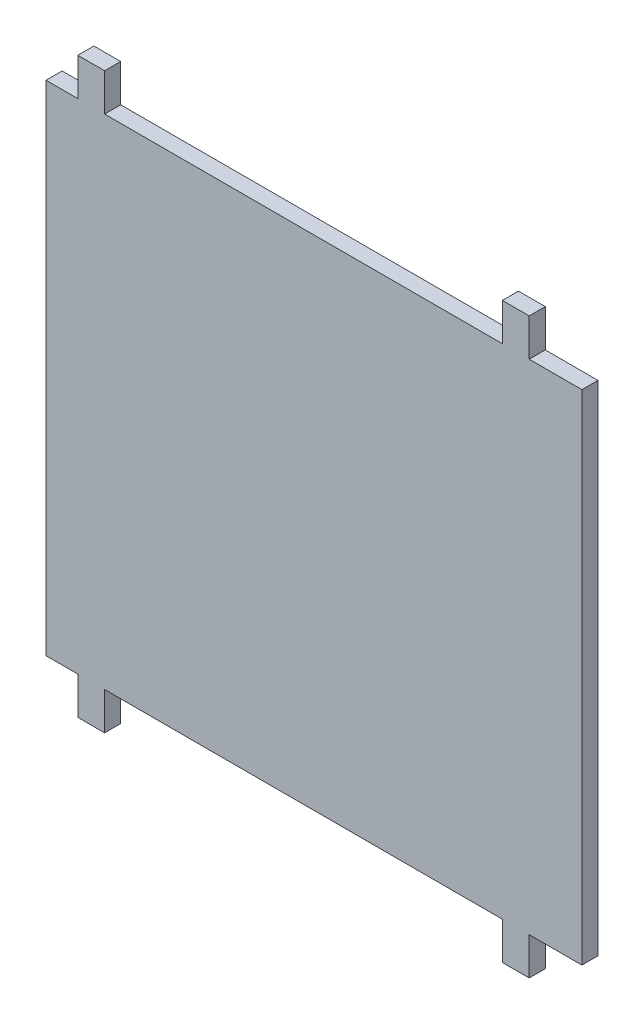
ISO-10303-21;
HEADER;
FILE_DESCRIPTION(('STEP AP214'),'2;1');
FILE_NAME('part.step','',(''),(''),'','','');
FILE_SCHEMA(('AUTOMOTIVE_DESIGN { 1 0 10303 214 1 1 1 1 }'));
ENDSEC;
DATA;
#1=APPLICATION_CONTEXT('core data for automotive mechanical design processes');
#2=APPLICATION_PROTOCOL_DEFINITION('international standard','automotive_design',2000,#1);
#3=PRODUCT_CONTEXT('',#1,'mechanical');
#4=PRODUCT('Part','Part','',(#3));
#5=PRODUCT_RELATED_PRODUCT_CATEGORY('part','',(#4));
#6=PRODUCT_DEFINITION_FORMATION('','',#4);
#7=PRODUCT_DEFINITION_CONTEXT('part definition',#1,'design');
#8=PRODUCT_DEFINITION('design','',#6,#7);
#9=PRODUCT_DEFINITION_SHAPE('','',#8);
#10=(LENGTH_UNIT() NAMED_UNIT(*) SI_UNIT(.MILLI.,.METRE.));
#11=(NAMED_UNIT(*) PLANE_ANGLE_UNIT() SI_UNIT($,.RADIAN.));
#12=(NAMED_UNIT(*) SI_UNIT($,.STERADIAN.) SOLID_ANGLE_UNIT());
#13=UNCERTAINTY_MEASURE_WITH_UNIT(LENGTH_MEASURE(1.E-05),#10,'distance_accuracy_value','');
#14=(GEOMETRIC_REPRESENTATION_CONTEXT(3) GLOBAL_UNCERTAINTY_ASSIGNED_CONTEXT((#13)) GLOBAL_UNIT_ASSIGNED_CONTEXT((#10,
#11,#12)) REPRESENTATION_CONTEXT('',''));
#15=CARTESIAN_POINT('',(0.,0.,0.));
#16=DIRECTION('',(0.,0.,1.));
#17=DIRECTION('',(1.,0.,0.));
#18=AXIS2_PLACEMENT_3D('',#15,#16,#17);
#19=CARTESIAN_POINT('',(0.,0.,3.));
#20=DIRECTION('',(1.,0.,0.));
#21=DIRECTION('',(0.,1.,0.));
#22=AXIS2_PLACEMENT_3D('',#19,#20,#21);
#23=PLANE('',#22);
#24=DIRECTION('',(0.,-1.,0.));
#25=VECTOR('',#24,1.);
#26=CARTESIAN_POINT('',(0.,0.,0.));
#27=LINE('',#26,#25);
#28=CARTESIAN_POINT('',(0.,-7.00000000000001,0.));
#29=VERTEX_POINT('',#28);
#30=CARTESIAN_POINT('',(0.,-100.,0.));
#31=VERTEX_POINT('',#30);
#32=EDGE_CURVE('E303',#29,#31,#27,.T.);
#33=ORIENTED_EDGE('',*,*,#32,.T.);
#34=DIRECTION('',(0.,0.,1.));
#35=VECTOR('',#34,1.);
#36=CARTESIAN_POINT('',(0.,-100.,-7.));
#37=LINE('',#36,#35);
#38=CARTESIAN_POINT('',(0.,-100.,3.));
#39=VERTEX_POINT('',#38);
#40=EDGE_CURVE('E290',#31,#39,#37,.T.);
#41=ORIENTED_EDGE('',*,*,#40,.T.);
#42=DIRECTION('',(0.,-1.,0.));
#43=VECTOR('',#42,1.);
#44=CARTESIAN_POINT('',(0.,0.,3.));
#45=LINE('',#44,#43);
#46=CARTESIAN_POINT('',(0.,-7.00000000000001,3.));
#47=VERTEX_POINT('',#46);
#48=EDGE_CURVE('E301',#47,#39,#45,.T.);
#49=ORIENTED_EDGE('',*,*,#48,.F.);
#50=DIRECTION('',(0.,0.,1.));
#51=VECTOR('',#50,1.);
#52=CARTESIAN_POINT('',(0.,-7.00000000000001,-7.));
#53=LINE('',#52,#51);
#54=EDGE_CURVE('E304',#29,#47,#53,.T.);
#55=ORIENTED_EDGE('',*,*,#54,.F.);
#56=EDGE_LOOP('',(#33,#41,#49,#55));
#57=FACE_BOUND('',#56,.T.);
#58=ADVANCED_FACE('F153',(#57),#23,.F.);
#59=CARTESIAN_POINT('',(0.,-107.,3.));
#60=DIRECTION('',(0.,1.,0.));
#61=DIRECTION('',(0.,0.,1.));
#62=AXIS2_PLACEMENT_3D('',#59,#60,#61);
#63=PLANE('',#62);
#64=DIRECTION('',(1.,0.,0.));
#65=VECTOR('',#64,1.);
#66=CARTESIAN_POINT('',(0.,-107.,0.));
#67=LINE('',#66,#65);
#68=CARTESIAN_POINT('',(85.1637968422524,-107.,0.));
#69=VERTEX_POINT('',#68);
#70=CARTESIAN_POINT('',(90.1637968422524,-107.,0.));
#71=VERTEX_POINT('',#70);
#72=EDGE_CURVE('E329',#69,#71,#67,.T.);
#73=ORIENTED_EDGE('',*,*,#72,.T.);
#74=DIRECTION('',(0.,0.,1.));
#75=VECTOR('',#74,1.);
#76=CARTESIAN_POINT('',(90.1637968422524,-107.,-7.));
#77=LINE('',#76,#75);
#78=CARTESIAN_POINT('',(90.1637968422524,-107.,3.));
#79=VERTEX_POINT('',#78);
#80=EDGE_CURVE('E175',#71,#79,#77,.T.);
#81=ORIENTED_EDGE('',*,*,#80,.T.);
#82=DIRECTION('',(1.,0.,0.));
#83=VECTOR('',#82,1.);
#84=CARTESIAN_POINT('',(0.,-107.,3.));
#85=LINE('',#84,#83);
#86=CARTESIAN_POINT('',(85.1637968422524,-107.,3.));
#87=VERTEX_POINT('',#86);
#88=EDGE_CURVE('E310',#87,#79,#85,.T.);
#89=ORIENTED_EDGE('',*,*,#88,.F.);
#90=DIRECTION('',(0.,0.,1.));
#91=VECTOR('',#90,1.);
#92=CARTESIAN_POINT('',(85.1637968422524,-107.,-7.));
#93=LINE('',#92,#91);
#94=EDGE_CURVE('E400',#69,#87,#93,.T.);
#95=ORIENTED_EDGE('',*,*,#94,.F.);
#96=EDGE_LOOP('',(#73,#81,#89,#95));
#97=FACE_BOUND('',#96,.T.);
#98=ADVANCED_FACE('F477',(#97),#63,.F.);
#99=CARTESIAN_POINT('',(100.,0.,3.));
#100=DIRECTION('',(-1.,0.,0.));
#101=DIRECTION('',(0.,-1.,0.));
#102=AXIS2_PLACEMENT_3D('',#99,#100,#101);
#103=PLANE('',#102);
#104=DIRECTION('',(0.,0.,1.));
#105=VECTOR('',#104,1.);
#106=CARTESIAN_POINT('',(100.,-7.,-7.));
#107=LINE('',#106,#105);
#108=CARTESIAN_POINT('',(100.,-7.,0.));
#109=VERTEX_POINT('',#108);
#110=CARTESIAN_POINT('',(100.,-7.,3.));
#111=VERTEX_POINT('',#110);
#112=EDGE_CURVE('E407',#109,#111,#107,.T.);
#113=ORIENTED_EDGE('',*,*,#112,.T.);
#114=DIRECTION('',(0.,1.,0.));
#115=VECTOR('',#114,1.);
#116=CARTESIAN_POINT('',(100.,0.,3.));
#117=LINE('',#116,#115);
#118=CARTESIAN_POINT('',(100.,-100.,3.));
#119=VERTEX_POINT('',#118);
#120=EDGE_CURVE('E321',#119,#111,#117,.T.);
#121=ORIENTED_EDGE('',*,*,#120,.F.);
#122=DIRECTION('',(0.,0.,1.));
#123=VECTOR('',#122,1.);
#124=CARTESIAN_POINT('',(100.,-100.,-7.));
#125=LINE('',#124,#123);
#126=CARTESIAN_POINT('',(100.,-100.,0.));
#127=VERTEX_POINT('',#126);
#128=EDGE_CURVE('E405',#127,#119,#125,.T.);
#129=ORIENTED_EDGE('',*,*,#128,.F.);
#130=DIRECTION('',(0.,1.,0.));
#131=VECTOR('',#130,1.);
#132=CARTESIAN_POINT('',(100.,0.,0.));
#133=LINE('',#132,#131);
#134=EDGE_CURVE('E333',#127,#109,#133,.T.);
#135=ORIENTED_EDGE('',*,*,#134,.T.);
#136=EDGE_LOOP('',(#113,#121,#129,#135));
#137=FACE_BOUND('',#136,.T.);
#138=ADVANCED_FACE('F488',(#137),#103,.F.);
#139=CARTESIAN_POINT('',(0.,0.,3.));
#140=DIRECTION('',(0.,-1.,0.));
#141=DIRECTION('',(0.,0.,-1.));
#142=AXIS2_PLACEMENT_3D('',#139,#140,#141);
#143=PLANE('',#142);
#144=DIRECTION('',(0.,0.,1.));
#145=VECTOR('',#144,1.);
#146=CARTESIAN_POINT('',(5.93350857221211,0.,-7.));
#147=LINE('',#146,#145);
#148=CARTESIAN_POINT('',(5.93350857221211,0.,0.));
#149=VERTEX_POINT('',#148);
#150=CARTESIAN_POINT('',(5.93350857221211,0.,3.));
#151=VERTEX_POINT('',#150);
#152=EDGE_CURVE('E371',#149,#151,#147,.T.);
#153=ORIENTED_EDGE('',*,*,#152,.T.);
#154=DIRECTION('',(-1.,0.,0.));
#155=VECTOR('',#154,1.);
#156=CARTESIAN_POINT('',(0.,0.,3.));
#157=LINE('',#156,#155);
#158=CARTESIAN_POINT('',(10.9335085722121,0.,3.));
#159=VERTEX_POINT('',#158);
#160=EDGE_CURVE('E324',#159,#151,#157,.T.);
#161=ORIENTED_EDGE('',*,*,#160,.F.);
#162=DIRECTION('',(0.,0.,1.));
#163=VECTOR('',#162,1.);
#164=CARTESIAN_POINT('',(10.9335085722121,0.,-7.));
#165=LINE('',#164,#163);
#166=CARTESIAN_POINT('',(10.9335085722121,0.,0.));
#167=VERTEX_POINT('',#166);
#168=EDGE_CURVE('E421',#167,#159,#165,.T.);
#169=ORIENTED_EDGE('',*,*,#168,.F.);
#170=DIRECTION('',(-1.,0.,0.));
#171=VECTOR('',#170,1.);
#172=CARTESIAN_POINT('',(0.,0.,0.));
#173=LINE('',#172,#171);
#174=EDGE_CURVE('E317',#167,#149,#173,.T.);
#175=ORIENTED_EDGE('',*,*,#174,.T.);
#176=EDGE_LOOP('',(#153,#161,#169,#175));
#177=FACE_BOUND('',#176,.T.);
#178=ADVANCED_FACE('F425',(#177),#143,.F.);
#179=DIRECTION('',(0.,0.,1.));
#180=VECTOR('',#179,1.);
#181=CARTESIAN_POINT('',(85.1637968422524,0.,-7.));
#182=LINE('',#181,#180);
#183=CARTESIAN_POINT('',(85.1637968422524,0.,0.));
#184=VERTEX_POINT('',#183);
#185=CARTESIAN_POINT('',(85.1637968422524,0.,3.));
#186=VERTEX_POINT('',#185);
#187=EDGE_CURVE('E414',#184,#186,#182,.T.);
#188=ORIENTED_EDGE('',*,*,#187,.T.);
#189=CARTESIAN_POINT('',(90.1637968422524,0.,3.));
#190=VERTEX_POINT('',#189);
#191=EDGE_CURVE('E327',#190,#186,#157,.T.);
#192=ORIENTED_EDGE('',*,*,#191,.F.);
#193=DIRECTION('',(0.,0.,1.));
#194=VECTOR('',#193,1.);
#195=CARTESIAN_POINT('',(90.1637968422524,0.,-7.));
#196=LINE('',#195,#194);
#197=CARTESIAN_POINT('',(90.1637968422524,0.,0.));
#198=VERTEX_POINT('',#197);
#199=EDGE_CURVE('E412',#198,#190,#196,.T.);
#200=ORIENTED_EDGE('',*,*,#199,.F.);
#201=EDGE_CURVE('E311',#198,#184,#173,.T.);
#202=ORIENTED_EDGE('',*,*,#201,.T.);
#203=EDGE_LOOP('',(#188,#192,#200,#202));
#204=FACE_BOUND('',#203,.T.);
#205=ADVANCED_FACE('F502',(#204),#143,.F.);
#206=CARTESIAN_POINT('',(0.,0.,3.));
#207=DIRECTION('',(0.,0.,1.));
#208=DIRECTION('',(1.,0.,0.));
#209=AXIS2_PLACEMENT_3D('',#206,#207,#208);
#210=PLANE('',#209);
#211=DIRECTION('',(0.,-1.,0.));
#212=VECTOR('',#211,1.);
#213=CARTESIAN_POINT('',(5.93350857221211,0.,3.));
#214=LINE('',#213,#212);
#215=CARTESIAN_POINT('',(5.93350857221211,-7.00000000000001,3.));
#216=VERTEX_POINT('',#215);
#217=EDGE_CURVE('E428',#151,#216,#214,.T.);
#218=ORIENTED_EDGE('',*,*,#217,.T.);
#219=DIRECTION('',(-1.,0.,0.));
#220=VECTOR('',#219,1.);
#221=CARTESIAN_POINT('',(0.,-7.00000000000001,3.));
#222=LINE('',#221,#220);
#223=EDGE_CURVE('E295',#216,#47,#222,.T.);
#224=ORIENTED_EDGE('',*,*,#223,.T.);
#225=ORIENTED_EDGE('',*,*,#48,.T.);
#226=DIRECTION('',(-1.,0.,0.));
#227=VECTOR('',#226,1.);
#228=CARTESIAN_POINT('',(0.,-100.,3.));
#229=LINE('',#228,#227);
#230=CARTESIAN_POINT('',(5.93350857221212,-100.,3.));
#231=VERTEX_POINT('',#230);
#232=EDGE_CURVE('E287',#231,#39,#229,.T.);
#233=ORIENTED_EDGE('',*,*,#232,.F.);
#234=DIRECTION('',(0.,1.,0.));
#235=VECTOR('',#234,1.);
#236=CARTESIAN_POINT('',(5.93350857221213,0.,3.));
#237=LINE('',#236,#235);
#238=CARTESIAN_POINT('',(5.93350857221212,-107.,3.));
#239=VERTEX_POINT('',#238);
#240=EDGE_CURVE('E393',#239,#231,#237,.T.);
#241=ORIENTED_EDGE('',*,*,#240,.F.);
#242=CARTESIAN_POINT('',(10.9335085722121,-107.,3.));
#243=VERTEX_POINT('',#242);
#244=EDGE_CURVE('E314',#239,#243,#85,.T.);
#245=ORIENTED_EDGE('',*,*,#244,.T.);
#246=DIRECTION('',(0.,-1.,0.));
#247=VECTOR('',#246,1.);
#248=CARTESIAN_POINT('',(10.9335085722121,0.,3.));
#249=LINE('',#248,#247);
#250=CARTESIAN_POINT('',(10.9335085722121,-100.,3.));
#251=VERTEX_POINT('',#250);
#252=EDGE_CURVE('E461',#251,#243,#249,.T.);
#253=ORIENTED_EDGE('',*,*,#252,.F.);
#254=DIRECTION('',(-1.,0.,0.));
#255=VECTOR('',#254,1.);
#256=CARTESIAN_POINT('',(0.,-100.,3.));
#257=LINE('',#256,#255);
#258=CARTESIAN_POINT('',(85.1637968422524,-100.,3.));
#259=VERTEX_POINT('',#258);
#260=EDGE_CURVE('E458',#259,#251,#257,.T.);
#261=ORIENTED_EDGE('',*,*,#260,.F.);
#262=DIRECTION('',(0.,1.,0.));
#263=VECTOR('',#262,1.);
#264=CARTESIAN_POINT('',(85.1637968422524,0.,3.));
#265=LINE('',#264,#263);
#266=EDGE_CURVE('E455',#87,#259,#265,.T.);
#267=ORIENTED_EDGE('',*,*,#266,.F.);
#268=ORIENTED_EDGE('',*,*,#88,.T.);
#269=DIRECTION('',(0.,-1.,0.));
#270=VECTOR('',#269,1.);
#271=CARTESIAN_POINT('',(90.1637968422524,0.,3.));
#272=LINE('',#271,#270);
#273=CARTESIAN_POINT('',(90.1637968422524,-100.,3.));
#274=VERTEX_POINT('',#273);
#275=EDGE_CURVE('E453',#274,#79,#272,.T.);
#276=ORIENTED_EDGE('',*,*,#275,.F.);
#277=DIRECTION('',(-1.,0.,0.));
#278=VECTOR('',#277,1.);
#279=CARTESIAN_POINT('',(0.,-100.,3.));
#280=LINE('',#279,#278);
#281=EDGE_CURVE('E450',#119,#274,#280,.T.);
#282=ORIENTED_EDGE('',*,*,#281,.F.);
#283=ORIENTED_EDGE('',*,*,#120,.T.);
#284=DIRECTION('',(-1.,0.,0.));
#285=VECTOR('',#284,1.);
#286=CARTESIAN_POINT('',(0.,-7.00000000000001,3.));
#287=LINE('',#286,#285);
#288=CARTESIAN_POINT('',(90.1637968422524,-7.,3.));
#289=VERTEX_POINT('',#288);
#290=EDGE_CURVE('E447',#111,#289,#287,.T.);
#291=ORIENTED_EDGE('',*,*,#290,.T.);
#292=DIRECTION('',(0.,1.,0.));
#293=VECTOR('',#292,1.);
#294=CARTESIAN_POINT('',(90.1637968422524,0.,3.));
#295=LINE('',#294,#293);
#296=EDGE_CURVE('E444',#289,#190,#295,.T.);
#297=ORIENTED_EDGE('',*,*,#296,.T.);
#298=ORIENTED_EDGE('',*,*,#191,.T.);
#299=DIRECTION('',(0.,-1.,0.));
#300=VECTOR('',#299,1.);
#301=CARTESIAN_POINT('',(85.1637968422524,0.,3.));
#302=LINE('',#301,#300);
#303=CARTESIAN_POINT('',(85.1637968422524,-7.,3.));
#304=VERTEX_POINT('',#303);
#305=EDGE_CURVE('E438',#186,#304,#302,.T.);
#306=ORIENTED_EDGE('',*,*,#305,.T.);
#307=DIRECTION('',(-1.,0.,0.));
#308=VECTOR('',#307,1.);
#309=CARTESIAN_POINT('',(0.,-7.00000000000001,3.));
#310=LINE('',#309,#308);
#311=CARTESIAN_POINT('',(10.9335085722121,-7.00000000000001,3.));
#312=VERTEX_POINT('',#311);
#313=EDGE_CURVE('E434',#304,#312,#310,.T.);
#314=ORIENTED_EDGE('',*,*,#313,.T.);
#315=DIRECTION('',(0.,1.,0.));
#316=VECTOR('',#315,1.);
#317=CARTESIAN_POINT('',(10.9335085722121,0.,3.));
#318=LINE('',#317,#316);
#319=EDGE_CURVE('E431',#312,#159,#318,.T.);
#320=ORIENTED_EDGE('',*,*,#319,.T.);
#321=ORIENTED_EDGE('',*,*,#160,.T.);
#322=EDGE_LOOP('',(#218,#224,#225,#233,#241,#245,#253,#261,#267,#268,#276,#282,#283,#291,#297,
#298,#306,#314,#320,#321));
#323=FACE_BOUND('',#322,.T.);
#324=ADVANCED_FACE('F308',(#323),#210,.T.);
#325=CARTESIAN_POINT('',(0.,0.,0.));
#326=DIRECTION('',(0.,0.,1.));
#327=DIRECTION('',(1.,0.,0.));
#328=AXIS2_PLACEMENT_3D('',#325,#326,#327);
#329=PLANE('',#328);
#330=DIRECTION('',(-1.,0.,0.));
#331=VECTOR('',#330,1.);
#332=CARTESIAN_POINT('',(0.,-7.00000000000001,0.));
#333=LINE('',#332,#331);
#334=CARTESIAN_POINT('',(5.93350857221211,-7.00000000000001,0.));
#335=VERTEX_POINT('',#334);
#336=EDGE_CURVE('E12',#335,#29,#333,.T.);
#337=ORIENTED_EDGE('',*,*,#336,.F.);
#338=DIRECTION('',(0.,-1.,0.));
#339=VECTOR('',#338,1.);
#340=CARTESIAN_POINT('',(5.93350857221211,0.,0.));
#341=LINE('',#340,#339);
#342=EDGE_CURVE('E160',#149,#335,#341,.T.);
#343=ORIENTED_EDGE('',*,*,#342,.F.);
#344=ORIENTED_EDGE('',*,*,#174,.F.);
#345=DIRECTION('',(0.,1.,0.));
#346=VECTOR('',#345,1.);
#347=CARTESIAN_POINT('',(10.9335085722121,0.,0.));
#348=LINE('',#347,#346);
#349=CARTESIAN_POINT('',(10.9335085722121,-7.00000000000001,0.));
#350=VERTEX_POINT('',#349);
#351=EDGE_CURVE('E364',#350,#167,#348,.T.);
#352=ORIENTED_EDGE('',*,*,#351,.F.);
#353=DIRECTION('',(-1.,0.,0.));
#354=VECTOR('',#353,1.);
#355=CARTESIAN_POINT('',(0.,-7.00000000000001,0.));
#356=LINE('',#355,#354);
#357=CARTESIAN_POINT('',(85.1637968422524,-7.,0.));
#358=VERTEX_POINT('',#357);
#359=EDGE_CURVE('E362',#358,#350,#356,.T.);
#360=ORIENTED_EDGE('',*,*,#359,.F.);
#361=DIRECTION('',(0.,-1.,0.));
#362=VECTOR('',#361,1.);
#363=CARTESIAN_POINT('',(85.1637968422524,0.,0.));
#364=LINE('',#363,#362);
#365=EDGE_CURVE('E360',#184,#358,#364,.T.);
#366=ORIENTED_EDGE('',*,*,#365,.F.);
#367=ORIENTED_EDGE('',*,*,#201,.F.);
#368=DIRECTION('',(0.,1.,0.));
#369=VECTOR('',#368,1.);
#370=CARTESIAN_POINT('',(90.1637968422524,0.,0.));
#371=LINE('',#370,#369);
#372=CARTESIAN_POINT('',(90.1637968422524,-7.,0.));
#373=VERTEX_POINT('',#372);
#374=EDGE_CURVE('E358',#373,#198,#371,.T.);
#375=ORIENTED_EDGE('',*,*,#374,.F.);
#376=DIRECTION('',(-1.,0.,0.));
#377=VECTOR('',#376,1.);
#378=CARTESIAN_POINT('',(0.,-7.00000000000001,0.));
#379=LINE('',#378,#377);
#380=EDGE_CURVE('E356',#109,#373,#379,.T.);
#381=ORIENTED_EDGE('',*,*,#380,.F.);
#382=ORIENTED_EDGE('',*,*,#134,.F.);
#383=DIRECTION('',(-1.,0.,0.));
#384=VECTOR('',#383,1.);
#385=CARTESIAN_POINT('',(0.,-100.,0.));
#386=LINE('',#385,#384);
#387=CARTESIAN_POINT('',(90.1637968422524,-100.,0.));
#388=VERTEX_POINT('',#387);
#389=EDGE_CURVE('E353',#127,#388,#386,.T.);
#390=ORIENTED_EDGE('',*,*,#389,.T.);
#391=DIRECTION('',(0.,-1.,0.));
#392=VECTOR('',#391,1.);
#393=CARTESIAN_POINT('',(90.1637968422524,0.,0.));
#394=LINE('',#393,#392);
#395=EDGE_CURVE('E351',#388,#71,#394,.T.);
#396=ORIENTED_EDGE('',*,*,#395,.T.);
#397=ORIENTED_EDGE('',*,*,#72,.F.);
#398=DIRECTION('',(0.,1.,0.));
#399=VECTOR('',#398,1.);
#400=CARTESIAN_POINT('',(85.1637968422524,0.,0.));
#401=LINE('',#400,#399);
#402=CARTESIAN_POINT('',(85.1637968422524,-100.,0.));
#403=VERTEX_POINT('',#402);
#404=EDGE_CURVE('E348',#69,#403,#401,.T.);
#405=ORIENTED_EDGE('',*,*,#404,.T.);
#406=DIRECTION('',(-1.,0.,0.));
#407=VECTOR('',#406,1.);
#408=CARTESIAN_POINT('',(0.,-100.,0.));
#409=LINE('',#408,#407);
#410=CARTESIAN_POINT('',(10.9335085722121,-100.,0.));
#411=VERTEX_POINT('',#410);
#412=EDGE_CURVE('E345',#403,#411,#409,.T.);
#413=ORIENTED_EDGE('',*,*,#412,.T.);
#414=DIRECTION('',(0.,-1.,0.));
#415=VECTOR('',#414,1.);
#416=CARTESIAN_POINT('',(10.9335085722121,0.,0.));
#417=LINE('',#416,#415);
#418=CARTESIAN_POINT('',(10.9335085722121,-107.,0.));
#419=VERTEX_POINT('',#418);
#420=EDGE_CURVE('E342',#411,#419,#417,.T.);
#421=ORIENTED_EDGE('',*,*,#420,.T.);
#422=CARTESIAN_POINT('',(5.93350857221212,-107.,0.));
#423=VERTEX_POINT('',#422);
#424=EDGE_CURVE('E332',#423,#419,#67,.T.);
#425=ORIENTED_EDGE('',*,*,#424,.F.);
#426=DIRECTION('',(0.,1.,0.));
#427=VECTOR('',#426,1.);
#428=CARTESIAN_POINT('',(5.93350857221213,0.,0.));
#429=LINE('',#428,#427);
#430=CARTESIAN_POINT('',(5.93350857221212,-100.,0.));
#431=VERTEX_POINT('',#430);
#432=EDGE_CURVE('E337',#423,#431,#429,.T.);
#433=ORIENTED_EDGE('',*,*,#432,.T.);
#434=DIRECTION('',(-1.,0.,0.));
#435=VECTOR('',#434,1.);
#436=CARTESIAN_POINT('',(0.,-100.,0.));
#437=LINE('',#436,#435);
#438=EDGE_CURVE('E340',#431,#31,#437,.T.);
#439=ORIENTED_EDGE('',*,*,#438,.T.);
#440=ORIENTED_EDGE('',*,*,#32,.F.);
#441=EDGE_LOOP('',(#337,#343,#344,#352,#360,#366,#367,#375,#381,#382,#390,#396,#397,#405,#413,
#421,#425,#433,#439,#440));
#442=FACE_BOUND('',#441,.T.);
#443=ADVANCED_FACE('F378',(#442),#329,.F.);
#444=ORIENTED_EDGE('',*,*,#424,.T.);
#445=DIRECTION('',(0.,0.,1.));
#446=VECTOR('',#445,1.);
#447=CARTESIAN_POINT('',(10.9335085722121,-107.,-7.));
#448=LINE('',#447,#446);
#449=EDGE_CURVE('E389',#419,#243,#448,.T.);
#450=ORIENTED_EDGE('',*,*,#449,.T.);
#451=ORIENTED_EDGE('',*,*,#244,.F.);
#452=DIRECTION('',(0.,0.,1.));
#453=VECTOR('',#452,1.);
#454=CARTESIAN_POINT('',(5.93350857221212,-107.,-7.));
#455=LINE('',#454,#453);
#456=EDGE_CURVE('E383',#423,#239,#455,.T.);
#457=ORIENTED_EDGE('',*,*,#456,.F.);
#458=EDGE_LOOP('',(#444,#450,#451,#457));
#459=FACE_BOUND('',#458,.T.);
#460=ADVANCED_FACE('F386',(#459),#63,.F.);
#461=CARTESIAN_POINT('',(5.93350857221213,0.,-7.));
#462=DIRECTION('',(1.,0.,0.));
#463=DIRECTION('',(0.,1.,0.));
#464=AXIS2_PLACEMENT_3D('',#461,#462,#463);
#465=PLANE('',#464);
#466=ORIENTED_EDGE('',*,*,#456,.T.);
#467=ORIENTED_EDGE('',*,*,#240,.T.);
#468=DIRECTION('',(0.,0.,1.));
#469=VECTOR('',#468,1.);
#470=CARTESIAN_POINT('',(5.93350857221212,-100.,-7.));
#471=LINE('',#470,#469);
#472=EDGE_CURVE('E167',#431,#231,#471,.T.);
#473=ORIENTED_EDGE('',*,*,#472,.F.);
#474=ORIENTED_EDGE('',*,*,#432,.F.);
#475=EDGE_LOOP('',(#466,#467,#473,#474));
#476=FACE_BOUND('',#475,.T.);
#477=ADVANCED_FACE('F382',(#476),#465,.F.);
#478=CARTESIAN_POINT('',(0.,-100.,-7.));
#479=DIRECTION('',(0.,1.,0.));
#480=DIRECTION('',(0.,0.,1.));
#481=AXIS2_PLACEMENT_3D('',#478,#479,#480);
#482=PLANE('',#481);
#483=ORIENTED_EDGE('',*,*,#472,.T.);
#484=ORIENTED_EDGE('',*,*,#232,.T.);
#485=ORIENTED_EDGE('',*,*,#40,.F.);
#486=ORIENTED_EDGE('',*,*,#438,.F.);
#487=EDGE_LOOP('',(#483,#484,#485,#486));
#488=FACE_BOUND('',#487,.T.);
#489=ADVANCED_FACE('F289',(#488),#482,.F.);
#490=CARTESIAN_POINT('',(10.9335085722121,0.,-7.));
#491=DIRECTION('',(-1.,0.,0.));
#492=DIRECTION('',(0.,0.,1.));
#493=AXIS2_PLACEMENT_3D('',#490,#491,#492);
#494=PLANE('',#493);
#495=DIRECTION('',(0.,0.,1.));
#496=VECTOR('',#495,1.);
#497=CARTESIAN_POINT('',(10.9335085722121,-100.,-7.));
#498=LINE('',#497,#496);
#499=EDGE_CURVE('E391',#411,#251,#498,.T.);
#500=ORIENTED_EDGE('',*,*,#499,.T.);
#501=ORIENTED_EDGE('',*,*,#252,.T.);
#502=ORIENTED_EDGE('',*,*,#449,.F.);
#503=ORIENTED_EDGE('',*,*,#420,.F.);
#504=EDGE_LOOP('',(#500,#501,#502,#503));
#505=FACE_BOUND('',#504,.T.);
#506=ADVANCED_FACE('F466',(#505),#494,.F.);
#507=CARTESIAN_POINT('',(0.,-100.,-7.));
#508=DIRECTION('',(0.,1.,0.));
#509=DIRECTION('',(-1.,0.,0.));
#510=AXIS2_PLACEMENT_3D('',#507,#508,#509);
#511=PLANE('',#510);
#512=DIRECTION('',(0.,0.,1.));
#513=VECTOR('',#512,1.);
#514=CARTESIAN_POINT('',(85.1637968422524,-100.,-7.));
#515=LINE('',#514,#513);
#516=EDGE_CURVE('E398',#403,#259,#515,.T.);
#517=ORIENTED_EDGE('',*,*,#516,.T.);
#518=ORIENTED_EDGE('',*,*,#260,.T.);
#519=ORIENTED_EDGE('',*,*,#499,.F.);
#520=ORIENTED_EDGE('',*,*,#412,.F.);
#521=EDGE_LOOP('',(#517,#518,#519,#520));
#522=FACE_BOUND('',#521,.T.);
#523=ADVANCED_FACE('F469',(#522),#511,.F.);
#524=CARTESIAN_POINT('',(85.1637968422524,0.,-7.));
#525=DIRECTION('',(1.,0.,0.));
#526=DIRECTION('',(0.,0.,-1.));
#527=AXIS2_PLACEMENT_3D('',#524,#525,#526);
#528=PLANE('',#527);
#529=ORIENTED_EDGE('',*,*,#94,.T.);
#530=ORIENTED_EDGE('',*,*,#266,.T.);
#531=ORIENTED_EDGE('',*,*,#516,.F.);
#532=ORIENTED_EDGE('',*,*,#404,.F.);
#533=EDGE_LOOP('',(#529,#530,#531,#532));
#534=FACE_BOUND('',#533,.T.);
#535=ADVANCED_FACE('F472',(#534),#528,.F.);
#536=CARTESIAN_POINT('',(90.1637968422524,0.,-7.));
#537=DIRECTION('',(-1.,0.,0.));
#538=DIRECTION('',(0.,0.,1.));
#539=AXIS2_PLACEMENT_3D('',#536,#537,#538);
#540=PLANE('',#539);
#541=DIRECTION('',(0.,0.,1.));
#542=VECTOR('',#541,1.);
#543=CARTESIAN_POINT('',(90.1637968422524,-100.,-7.));
#544=LINE('',#543,#542);
#545=EDGE_CURVE('E403',#388,#274,#544,.T.);
#546=ORIENTED_EDGE('',*,*,#545,.T.);
#547=ORIENTED_EDGE('',*,*,#275,.T.);
#548=ORIENTED_EDGE('',*,*,#80,.F.);
#549=ORIENTED_EDGE('',*,*,#395,.F.);
#550=EDGE_LOOP('',(#546,#547,#548,#549));
#551=FACE_BOUND('',#550,.T.);
#552=ADVANCED_FACE('F481',(#551),#540,.F.);
#553=CARTESIAN_POINT('',(0.,-100.,-7.));
#554=DIRECTION('',(0.,1.,0.));
#555=DIRECTION('',(0.,0.,1.));
#556=AXIS2_PLACEMENT_3D('',#553,#554,#555);
#557=PLANE('',#556);
#558=ORIENTED_EDGE('',*,*,#128,.T.);
#559=ORIENTED_EDGE('',*,*,#281,.T.);
#560=ORIENTED_EDGE('',*,*,#545,.F.);
#561=ORIENTED_EDGE('',*,*,#389,.F.);
#562=EDGE_LOOP('',(#558,#559,#560,#561));
#563=FACE_BOUND('',#562,.T.);
#564=ADVANCED_FACE('F483',(#563),#557,.F.);
#565=CARTESIAN_POINT('',(0.,-7.00000000000001,-7.));
#566=DIRECTION('',(0.,1.,0.));
#567=DIRECTION('',(-1.,0.,0.));
#568=AXIS2_PLACEMENT_3D('',#565,#566,#567);
#569=PLANE('',#568);
#570=ORIENTED_EDGE('',*,*,#380,.T.);
#571=DIRECTION('',(0.,0.,1.));
#572=VECTOR('',#571,1.);
#573=CARTESIAN_POINT('',(90.1637968422524,-7.,-7.));
#574=LINE('',#573,#572);
#575=EDGE_CURVE('E410',#373,#289,#574,.T.);
#576=ORIENTED_EDGE('',*,*,#575,.T.);
#577=ORIENTED_EDGE('',*,*,#290,.F.);
#578=ORIENTED_EDGE('',*,*,#112,.F.);
#579=EDGE_LOOP('',(#570,#576,#577,#578));
#580=FACE_BOUND('',#579,.T.);
#581=ADVANCED_FACE('F491',(#580),#569,.T.);
#582=CARTESIAN_POINT('',(90.1637968422524,0.,-7.));
#583=DIRECTION('',(1.,0.,0.));
#584=DIRECTION('',(0.,0.,-1.));
#585=AXIS2_PLACEMENT_3D('',#582,#583,#584);
#586=PLANE('',#585);
#587=ORIENTED_EDGE('',*,*,#374,.T.);
#588=ORIENTED_EDGE('',*,*,#199,.T.);
#589=ORIENTED_EDGE('',*,*,#296,.F.);
#590=ORIENTED_EDGE('',*,*,#575,.F.);
#591=EDGE_LOOP('',(#587,#588,#589,#590));
#592=FACE_BOUND('',#591,.T.);
#593=ADVANCED_FACE('F498',(#592),#586,.T.);
#594=CARTESIAN_POINT('',(85.1637968422524,0.,-7.));
#595=DIRECTION('',(-1.,0.,0.));
#596=DIRECTION('',(0.,0.,1.));
#597=AXIS2_PLACEMENT_3D('',#594,#595,#596);
#598=PLANE('',#597);
#599=ORIENTED_EDGE('',*,*,#365,.T.);
#600=DIRECTION('',(0.,0.,1.));
#601=VECTOR('',#600,1.);
#602=CARTESIAN_POINT('',(85.1637968422524,-7.,-7.));
#603=LINE('',#602,#601);
#604=EDGE_CURVE('E417',#358,#304,#603,.T.);
#605=ORIENTED_EDGE('',*,*,#604,.T.);
#606=ORIENTED_EDGE('',*,*,#305,.F.);
#607=ORIENTED_EDGE('',*,*,#187,.F.);
#608=EDGE_LOOP('',(#599,#605,#606,#607));
#609=FACE_BOUND('',#608,.T.);
#610=ADVANCED_FACE('F505',(#609),#598,.T.);
#611=CARTESIAN_POINT('',(0.,-7.00000000000001,-7.));
#612=DIRECTION('',(0.,1.,0.));
#613=DIRECTION('',(-1.,0.,0.));
#614=AXIS2_PLACEMENT_3D('',#611,#612,#613);
#615=PLANE('',#614);
#616=ORIENTED_EDGE('',*,*,#359,.T.);
#617=DIRECTION('',(0.,0.,1.));
#618=VECTOR('',#617,1.);
#619=CARTESIAN_POINT('',(10.9335085722121,-7.00000000000001,-7.));
#620=LINE('',#619,#618);
#621=EDGE_CURVE('E419',#350,#312,#620,.T.);
#622=ORIENTED_EDGE('',*,*,#621,.T.);
#623=ORIENTED_EDGE('',*,*,#313,.F.);
#624=ORIENTED_EDGE('',*,*,#604,.F.);
#625=EDGE_LOOP('',(#616,#622,#623,#624));
#626=FACE_BOUND('',#625,.T.);
#627=ADVANCED_FACE('F509',(#626),#615,.T.);
#628=CARTESIAN_POINT('',(10.9335085722121,0.,-7.));
#629=DIRECTION('',(1.,0.,0.));
#630=DIRECTION('',(0.,1.,0.));
#631=AXIS2_PLACEMENT_3D('',#628,#629,#630);
#632=PLANE('',#631);
#633=ORIENTED_EDGE('',*,*,#351,.T.);
#634=ORIENTED_EDGE('',*,*,#168,.T.);
#635=ORIENTED_EDGE('',*,*,#319,.F.);
#636=ORIENTED_EDGE('',*,*,#621,.F.);
#637=EDGE_LOOP('',(#633,#634,#635,#636));
#638=FACE_BOUND('',#637,.T.);
#639=ADVANCED_FACE('F511',(#638),#632,.T.);
#640=CARTESIAN_POINT('',(0.,-7.00000000000001,-7.));
#641=DIRECTION('',(0.,1.,0.));
#642=DIRECTION('',(-1.,0.,0.));
#643=AXIS2_PLACEMENT_3D('',#640,#641,#642);
#644=PLANE('',#643);
#645=ORIENTED_EDGE('',*,*,#336,.T.);
#646=ORIENTED_EDGE('',*,*,#54,.T.);
#647=ORIENTED_EDGE('',*,*,#223,.F.);
#648=DIRECTION('',(0.,0.,1.));
#649=VECTOR('',#648,1.);
#650=CARTESIAN_POINT('',(5.93350857221211,-7.00000000000001,-7.));
#651=LINE('',#650,#649);
#652=EDGE_CURVE('E369',#335,#216,#651,.T.);
#653=ORIENTED_EDGE('',*,*,#652,.F.);
#654=EDGE_LOOP('',(#645,#646,#647,#653));
#655=FACE_BOUND('',#654,.T.);
#656=ADVANCED_FACE('F376',(#655),#644,.T.);
#657=CARTESIAN_POINT('',(5.93350857221211,0.,-7.));
#658=DIRECTION('',(-1.,0.,0.));
#659=DIRECTION('',(0.,-1.,0.));
#660=AXIS2_PLACEMENT_3D('',#657,#658,#659);
#661=PLANE('',#660);
#662=ORIENTED_EDGE('',*,*,#342,.T.);
#663=ORIENTED_EDGE('',*,*,#652,.T.);
#664=ORIENTED_EDGE('',*,*,#217,.F.);
#665=ORIENTED_EDGE('',*,*,#152,.F.);
#666=EDGE_LOOP('',(#662,#663,#664,#665));
#667=FACE_BOUND('',#666,.T.);
#668=ADVANCED_FACE('F368',(#667),#661,.T.);
#669=CLOSED_SHELL('',(#58,#98,#138,#178,#205,#324,#443,#460,#477,#489,#506,#523,#535,#552,#564,
#581,#593,#610,#627,#639,#656,#668));
#670=MANIFOLD_SOLID_BREP('B2',#669);
#671=ADVANCED_BREP_SHAPE_REPRESENTATION('',(#18,#670),#14);
#672=SHAPE_DEFINITION_REPRESENTATION(#9,#671);
ENDSEC;
END-ISO-10303-21;
